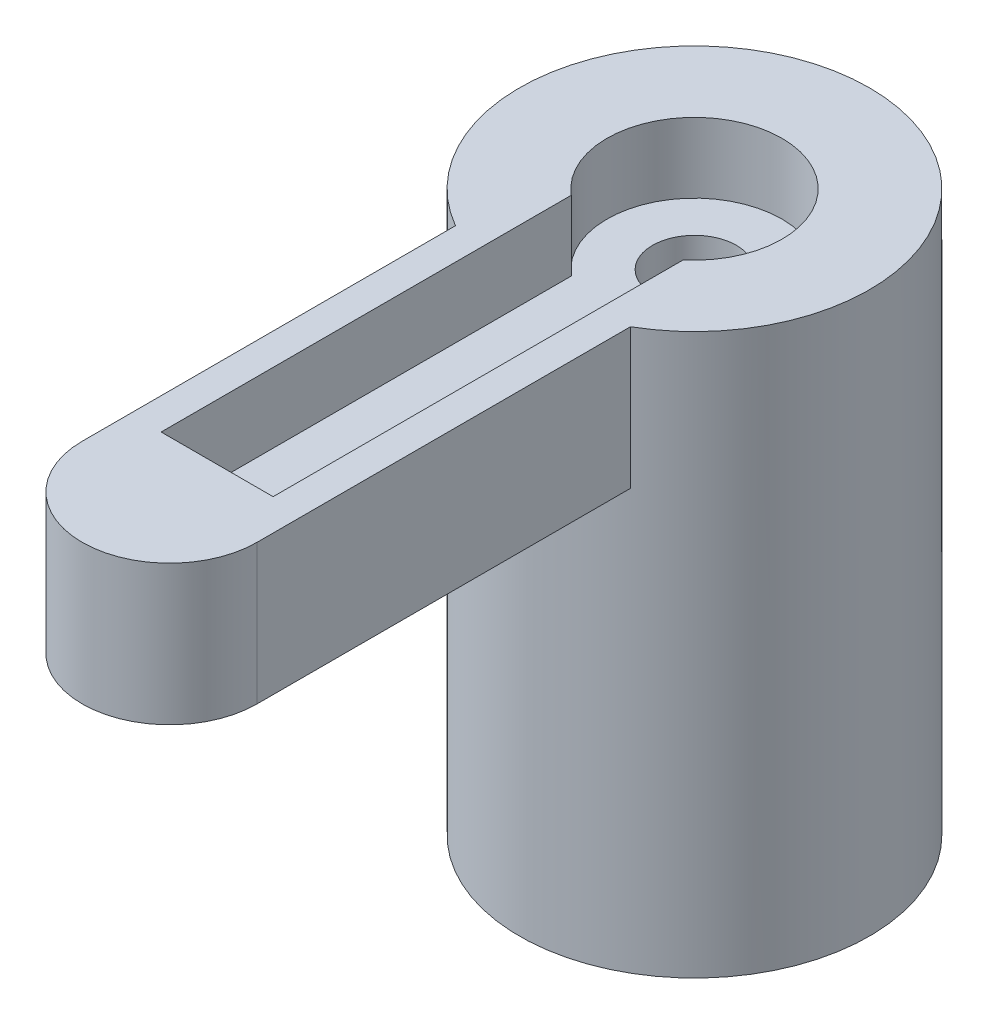
ISO-10303-21;
HEADER;
FILE_DESCRIPTION(('STEP AP214'),'2;1');
FILE_NAME('part.step','',(''),(''),'','','');
FILE_SCHEMA(('AUTOMOTIVE_DESIGN { 1 0 10303 214 1 1 1 1 }'));
ENDSEC;
DATA;
#1=APPLICATION_CONTEXT('core data for automotive mechanical design processes');
#2=APPLICATION_PROTOCOL_DEFINITION('international standard','automotive_design',2000,#1);
#3=PRODUCT_CONTEXT('',#1,'mechanical');
#4=PRODUCT('Part','Part','',(#3));
#5=PRODUCT_RELATED_PRODUCT_CATEGORY('part','',(#4));
#6=PRODUCT_DEFINITION_FORMATION('','',#4);
#7=PRODUCT_DEFINITION_CONTEXT('part definition',#1,'design');
#8=PRODUCT_DEFINITION('design','',#6,#7);
#9=PRODUCT_DEFINITION_SHAPE('','',#8);
#10=(LENGTH_UNIT() NAMED_UNIT(*) SI_UNIT(.MILLI.,.METRE.));
#11=(NAMED_UNIT(*) PLANE_ANGLE_UNIT() SI_UNIT($,.RADIAN.));
#12=(NAMED_UNIT(*) SI_UNIT($,.STERADIAN.) SOLID_ANGLE_UNIT());
#13=UNCERTAINTY_MEASURE_WITH_UNIT(LENGTH_MEASURE(1.E-05),#10,'distance_accuracy_value','');
#14=(GEOMETRIC_REPRESENTATION_CONTEXT(3) GLOBAL_UNCERTAINTY_ASSIGNED_CONTEXT((#13)) GLOBAL_UNIT_ASSIGNED_CONTEXT((#10,
#11,#12)) REPRESENTATION_CONTEXT('',''));
#15=CARTESIAN_POINT('',(0.,0.,0.));
#16=DIRECTION('',(0.,0.,1.));
#17=DIRECTION('',(1.,0.,0.));
#18=AXIS2_PLACEMENT_3D('',#15,#16,#17);
#19=CARTESIAN_POINT('',(0.,0.,0.));
#20=DIRECTION('',(0.,1.,0.));
#21=DIRECTION('',(0.,0.,1.));
#22=AXIS2_PLACEMENT_3D('',#19,#20,#21);
#23=PLANE('',#22);
#24=CARTESIAN_POINT('',(0.,0.,0.));
#25=DIRECTION('',(0.,-1.,0.));
#26=DIRECTION('',(0.,0.,-1.));
#27=AXIS2_PLACEMENT_3D('',#24,#25,#26);
#28=CIRCLE('',#27,6.35);
#29=CARTESIAN_POINT('',(3.175,0.,5.49926131403118));
#30=VERTEX_POINT('',#29);
#31=CARTESIAN_POINT('',(-3.175,0.,5.49926131403119));
#32=VERTEX_POINT('',#31);
#33=EDGE_CURVE('E126',#30,#32,#28,.T.);
#34=ORIENTED_EDGE('',*,*,#33,.F.);
#35=DIRECTION('',(0.,0.,1.));
#36=VECTOR('',#35,1.);
#37=CARTESIAN_POINT('',(3.175,0.,0.));
#38=LINE('',#37,#36);
#39=CARTESIAN_POINT('',(3.175,0.,19.05));
#40=VERTEX_POINT('',#39);
#41=EDGE_CURVE('E128',#30,#40,#38,.T.);
#42=ORIENTED_EDGE('',*,*,#41,.T.);
#43=CARTESIAN_POINT('',(0.,0.,19.05));
#44=DIRECTION('',(0.,1.,0.));
#45=DIRECTION('',(0.,0.,1.));
#46=AXIS2_PLACEMENT_3D('',#43,#44,#45);
#47=CIRCLE('',#46,3.175);
#48=CARTESIAN_POINT('',(-3.17499999999999,0.,19.05));
#49=VERTEX_POINT('',#48);
#50=EDGE_CURVE('E142',#49,#40,#47,.T.);
#51=ORIENTED_EDGE('',*,*,#50,.F.);
#52=DIRECTION('',(0.,0.,1.));
#53=VECTOR('',#52,1.);
#54=CARTESIAN_POINT('',(-3.175,0.,0.));
#55=LINE('',#54,#53);
#56=EDGE_CURVE('E129',#32,#49,#55,.T.);
#57=ORIENTED_EDGE('',*,*,#56,.F.);
#58=EDGE_LOOP('',(#34,#42,#51,#57));
#59=FACE_BOUND('',#58,.T.);
#60=ADVANCED_FACE('F50',(#59),#23,.F.);
#61=CARTESIAN_POINT('',(0.,5.08,0.));
#62=DIRECTION('',(0.,-1.,0.));
#63=DIRECTION('',(0.,0.,-1.));
#64=AXIS2_PLACEMENT_3D('',#61,#62,#63);
#65=CYLINDRICAL_SURFACE('',#64,6.35);
#66=DIRECTION('',(0.,-1.,0.));
#67=VECTOR('',#66,1.);
#68=CARTESIAN_POINT('',(3.175,5.08,5.49926131403118));
#69=LINE('',#68,#67);
#70=CARTESIAN_POINT('',(3.175,5.08,5.49926131403118));
#71=VERTEX_POINT('',#70);
#72=EDGE_CURVE('E76',#71,#30,#69,.T.);
#73=ORIENTED_EDGE('',*,*,#72,.T.);
#74=ORIENTED_EDGE('',*,*,#33,.T.);
#75=DIRECTION('',(0.,-1.,0.));
#76=VECTOR('',#75,1.);
#77=CARTESIAN_POINT('',(-3.175,5.08,5.49926131403119));
#78=LINE('',#77,#76);
#79=CARTESIAN_POINT('',(-3.175,5.08,5.49926131403119));
#80=VERTEX_POINT('',#79);
#81=EDGE_CURVE('E12',#80,#32,#78,.T.);
#82=ORIENTED_EDGE('',*,*,#81,.F.);
#83=CARTESIAN_POINT('',(0.,5.08,0.));
#84=DIRECTION('',(0.,1.,0.));
#85=DIRECTION('',(0.,0.,1.));
#86=AXIS2_PLACEMENT_3D('',#83,#84,#85);
#87=CIRCLE('',#86,6.35);
#88=EDGE_CURVE('E137',#71,#80,#87,.T.);
#89=ORIENTED_EDGE('',*,*,#88,.F.);
#90=EDGE_LOOP('',(#73,#74,#82,#89));
#91=FACE_BOUND('',#90,.T.);
#92=CARTESIAN_POINT('',(0.,-15.24,0.));
#93=DIRECTION('',(0.,-1.,0.));
#94=DIRECTION('',(0.,0.,-1.));
#95=AXIS2_PLACEMENT_3D('',#92,#93,#94);
#96=CIRCLE('',#95,6.35);
#97=CARTESIAN_POINT('',(0.,-15.24,-6.35));
#98=VERTEX_POINT('',#97);
#99=EDGE_CURVE('E132',#98,#98,#96,.T.);
#100=ORIENTED_EDGE('',*,*,#99,.F.);
#101=EDGE_LOOP('',(#100));
#102=FACE_BOUND('',#101,.T.);
#103=ADVANCED_FACE('F135',(#91,#102),#65,.T.);
#104=CARTESIAN_POINT('',(-3.175,5.08,0.));
#105=DIRECTION('',(1.,0.,0.));
#106=DIRECTION('',(0.,0.,-1.));
#107=AXIS2_PLACEMENT_3D('',#104,#105,#106);
#108=PLANE('',#107);
#109=ORIENTED_EDGE('',*,*,#56,.T.);
#110=DIRECTION('',(0.,-1.,0.));
#111=VECTOR('',#110,1.);
#112=CARTESIAN_POINT('',(-3.17499999999999,5.08,19.05));
#113=LINE('',#112,#111);
#114=CARTESIAN_POINT('',(-3.17499999999999,5.08,19.05));
#115=VERTEX_POINT('',#114);
#116=EDGE_CURVE('E59',#115,#49,#113,.T.);
#117=ORIENTED_EDGE('',*,*,#116,.F.);
#118=DIRECTION('',(0.,0.,1.));
#119=VECTOR('',#118,1.);
#120=CARTESIAN_POINT('',(-3.175,5.08,0.));
#121=LINE('',#120,#119);
#122=EDGE_CURVE('E100',#80,#115,#121,.T.);
#123=ORIENTED_EDGE('',*,*,#122,.F.);
#124=ORIENTED_EDGE('',*,*,#81,.T.);
#125=EDGE_LOOP('',(#109,#117,#123,#124));
#126=FACE_BOUND('',#125,.T.);
#127=ADVANCED_FACE('F196',(#126),#108,.F.);
#128=CARTESIAN_POINT('',(0.,5.08,19.05));
#129=DIRECTION('',(0.,-1.,0.));
#130=DIRECTION('',(0.,0.,-1.));
#131=AXIS2_PLACEMENT_3D('',#128,#129,#130);
#132=CYLINDRICAL_SURFACE('',#131,3.175);
#133=ORIENTED_EDGE('',*,*,#50,.T.);
#134=DIRECTION('',(0.,-1.,0.));
#135=VECTOR('',#134,1.);
#136=CARTESIAN_POINT('',(3.175,5.08,19.05));
#137=LINE('',#136,#135);
#138=CARTESIAN_POINT('',(3.175,5.08,19.05));
#139=VERTEX_POINT('',#138);
#140=EDGE_CURVE('E93',#139,#40,#137,.T.);
#141=ORIENTED_EDGE('',*,*,#140,.F.);
#142=CARTESIAN_POINT('',(0.,5.08,19.05));
#143=DIRECTION('',(0.,1.,0.));
#144=DIRECTION('',(0.,0.,1.));
#145=AXIS2_PLACEMENT_3D('',#142,#143,#144);
#146=CIRCLE('',#145,3.175);
#147=EDGE_CURVE('E189',#115,#139,#146,.T.);
#148=ORIENTED_EDGE('',*,*,#147,.F.);
#149=ORIENTED_EDGE('',*,*,#116,.T.);
#150=EDGE_LOOP('',(#133,#141,#148,#149));
#151=FACE_BOUND('',#150,.T.);
#152=ADVANCED_FACE('F195',(#151),#132,.T.);
#153=CARTESIAN_POINT('',(0.,5.08,0.));
#154=DIRECTION('',(0.,-1.,0.));
#155=DIRECTION('',(0.,0.,-1.));
#156=AXIS2_PLACEMENT_3D('',#153,#154,#155);
#157=CYLINDRICAL_SURFACE('',#156,1.524);
#158=CARTESIAN_POINT('',(0.,2.54,0.));
#159=DIRECTION('',(0.,-1.,0.));
#160=DIRECTION('',(0.,0.,-1.));
#161=AXIS2_PLACEMENT_3D('',#158,#159,#160);
#162=CIRCLE('',#161,1.524);
#163=CARTESIAN_POINT('',(0.,2.54,-1.524));
#164=VERTEX_POINT('',#163);
#165=EDGE_CURVE('E153',#164,#164,#162,.T.);
#166=ORIENTED_EDGE('',*,*,#165,.F.);
#167=EDGE_LOOP('',(#166));
#168=FACE_BOUND('',#167,.T.);
#169=CARTESIAN_POINT('',(0.,0.,0.));
#170=DIRECTION('',(0.,-1.,0.));
#171=DIRECTION('',(0.,0.,-1.));
#172=AXIS2_PLACEMENT_3D('',#169,#170,#171);
#173=CIRCLE('',#172,1.524);
#174=CARTESIAN_POINT('',(0.,0.,-1.524));
#175=VERTEX_POINT('',#174);
#176=EDGE_CURVE('E133',#175,#175,#173,.T.);
#177=ORIENTED_EDGE('',*,*,#176,.T.);
#178=EDGE_LOOP('',(#177));
#179=FACE_BOUND('',#178,.T.);
#180=ADVANCED_FACE('F52',(#168,#179),#157,.F.);
#181=CARTESIAN_POINT('',(3.175,5.08,0.));
#182=DIRECTION('',(1.,0.,0.));
#183=DIRECTION('',(0.,0.,-1.));
#184=AXIS2_PLACEMENT_3D('',#181,#182,#183);
#185=PLANE('',#184);
#186=ORIENTED_EDGE('',*,*,#41,.F.);
#187=ORIENTED_EDGE('',*,*,#72,.F.);
#188=DIRECTION('',(0.,0.,1.));
#189=VECTOR('',#188,1.);
#190=CARTESIAN_POINT('',(3.175,5.08,0.));
#191=LINE('',#190,#189);
#192=EDGE_CURVE('E139',#71,#139,#191,.T.);
#193=ORIENTED_EDGE('',*,*,#192,.T.);
#194=ORIENTED_EDGE('',*,*,#140,.T.);
#195=EDGE_LOOP('',(#186,#187,#193,#194));
#196=FACE_BOUND('',#195,.T.);
#197=ADVANCED_FACE('F141',(#196),#185,.T.);
#198=CARTESIAN_POINT('',(0.,5.08,0.));
#199=DIRECTION('',(0.,1.,0.));
#200=DIRECTION('',(0.,0.,1.));
#201=AXIS2_PLACEMENT_3D('',#198,#199,#200);
#202=PLANE('',#201);
#203=DIRECTION('',(1.,0.,0.));
#204=VECTOR('',#203,1.);
#205=CARTESIAN_POINT('',(-2.032,5.08,17.3245473419409));
#206=LINE('',#205,#204);
#207=CARTESIAN_POINT('',(-2.032,5.08,17.3245473419409));
#208=VERTEX_POINT('',#207);
#209=CARTESIAN_POINT('',(2.032,5.08,17.3245473419409));
#210=VERTEX_POINT('',#209);
#211=EDGE_CURVE('E170',#208,#210,#206,.T.);
#212=ORIENTED_EDGE('',*,*,#211,.F.);
#213=DIRECTION('',(0.,0.,1.));
#214=VECTOR('',#213,1.);
#215=CARTESIAN_POINT('',(-2.032,5.08,-0.455452658059131));
#216=LINE('',#215,#214);
#217=CARTESIAN_POINT('',(-2.032,5.08,2.43959033446192));
#218=VERTEX_POINT('',#217);
#219=EDGE_CURVE('E163',#218,#208,#216,.T.);
#220=ORIENTED_EDGE('',*,*,#219,.F.);
#221=CARTESIAN_POINT('',(0.,5.08,0.));
#222=DIRECTION('',(0.,1.,0.));
#223=DIRECTION('',(0.,0.,1.));
#224=AXIS2_PLACEMENT_3D('',#221,#222,#223);
#225=CIRCLE('',#224,3.175);
#226=CARTESIAN_POINT('',(2.032,5.08,2.43959033446191));
#227=VERTEX_POINT('',#226);
#228=EDGE_CURVE('E182',#227,#218,#225,.T.);
#229=ORIENTED_EDGE('',*,*,#228,.F.);
#230=DIRECTION('',(0.,0.,1.));
#231=VECTOR('',#230,1.);
#232=CARTESIAN_POINT('',(2.032,5.08,-0.455452658059131));
#233=LINE('',#232,#231);
#234=EDGE_CURVE('E67',#227,#210,#233,.T.);
#235=ORIENTED_EDGE('',*,*,#234,.T.);
#236=EDGE_LOOP('',(#212,#220,#229,#235));
#237=FACE_BOUND('',#236,.T.);
#238=ORIENTED_EDGE('',*,*,#88,.T.);
#239=ORIENTED_EDGE('',*,*,#122,.T.);
#240=ORIENTED_EDGE('',*,*,#147,.T.);
#241=ORIENTED_EDGE('',*,*,#192,.F.);
#242=EDGE_LOOP('',(#238,#239,#240,#241));
#243=FACE_BOUND('',#242,.T.);
#244=ADVANCED_FACE('F210',(#237,#243),#202,.T.);
#245=CARTESIAN_POINT('',(-2.032,2.54,17.3245473419409));
#246=DIRECTION('',(0.,0.,1.));
#247=DIRECTION('',(1.,0.,0.));
#248=AXIS2_PLACEMENT_3D('',#245,#246,#247);
#249=PLANE('',#248);
#250=ORIENTED_EDGE('',*,*,#211,.T.);
#251=DIRECTION('',(0.,1.,0.));
#252=VECTOR('',#251,1.);
#253=CARTESIAN_POINT('',(2.032,2.54,17.3245473419409));
#254=LINE('',#253,#252);
#255=CARTESIAN_POINT('',(2.032,2.54,17.3245473419409));
#256=VERTEX_POINT('',#255);
#257=EDGE_CURVE('E177',#256,#210,#254,.T.);
#258=ORIENTED_EDGE('',*,*,#257,.F.);
#259=DIRECTION('',(1.,0.,0.));
#260=VECTOR('',#259,1.);
#261=CARTESIAN_POINT('',(-2.032,2.54,17.3245473419409));
#262=LINE('',#261,#260);
#263=CARTESIAN_POINT('',(-2.032,2.54,17.3245473419409));
#264=VERTEX_POINT('',#263);
#265=EDGE_CURVE('E162',#264,#256,#262,.T.);
#266=ORIENTED_EDGE('',*,*,#265,.F.);
#267=DIRECTION('',(0.,1.,0.));
#268=VECTOR('',#267,1.);
#269=CARTESIAN_POINT('',(-2.032,2.54,17.3245473419409));
#270=LINE('',#269,#268);
#271=EDGE_CURVE('E168',#264,#208,#270,.T.);
#272=ORIENTED_EDGE('',*,*,#271,.T.);
#273=EDGE_LOOP('',(#250,#258,#266,#272));
#274=FACE_BOUND('',#273,.T.);
#275=ADVANCED_FACE('F217',(#274),#249,.F.);
#276=CARTESIAN_POINT('',(-2.032,2.54,-0.455452658059131));
#277=DIRECTION('',(-1.,0.,0.));
#278=DIRECTION('',(0.,0.,1.));
#279=AXIS2_PLACEMENT_3D('',#276,#277,#278);
#280=PLANE('',#279);
#281=DIRECTION('',(0.,1.,0.));
#282=VECTOR('',#281,1.);
#283=CARTESIAN_POINT('',(-2.032,2.54,2.43959033446192));
#284=LINE('',#283,#282);
#285=CARTESIAN_POINT('',(-2.032,2.54,2.43959033446192));
#286=VERTEX_POINT('',#285);
#287=EDGE_CURVE('E179',#286,#218,#284,.T.);
#288=ORIENTED_EDGE('',*,*,#287,.T.);
#289=ORIENTED_EDGE('',*,*,#219,.T.);
#290=ORIENTED_EDGE('',*,*,#271,.F.);
#291=DIRECTION('',(0.,0.,1.));
#292=VECTOR('',#291,1.);
#293=CARTESIAN_POINT('',(-2.032,2.54,-0.455452658059131));
#294=LINE('',#293,#292);
#295=EDGE_CURVE('E166',#286,#264,#294,.T.);
#296=ORIENTED_EDGE('',*,*,#295,.F.);
#297=EDGE_LOOP('',(#288,#289,#290,#296));
#298=FACE_BOUND('',#297,.T.);
#299=ADVANCED_FACE('F260',(#298),#280,.F.);
#300=CARTESIAN_POINT('',(2.032,2.54,-0.455452658059131));
#301=DIRECTION('',(-1.,0.,0.));
#302=DIRECTION('',(0.,0.,1.));
#303=AXIS2_PLACEMENT_3D('',#300,#301,#302);
#304=PLANE('',#303);
#305=DIRECTION('',(0.,0.,1.));
#306=VECTOR('',#305,1.);
#307=CARTESIAN_POINT('',(2.032,2.54,-0.455452658059131));
#308=LINE('',#307,#306);
#309=CARTESIAN_POINT('',(2.032,2.54,2.43959033446191));
#310=VERTEX_POINT('',#309);
#311=EDGE_CURVE('E160',#310,#256,#308,.T.);
#312=ORIENTED_EDGE('',*,*,#311,.T.);
#313=ORIENTED_EDGE('',*,*,#257,.T.);
#314=ORIENTED_EDGE('',*,*,#234,.F.);
#315=DIRECTION('',(0.,1.,0.));
#316=VECTOR('',#315,1.);
#317=CARTESIAN_POINT('',(2.032,2.54,2.43959033446191));
#318=LINE('',#317,#316);
#319=EDGE_CURVE('E186',#310,#227,#318,.T.);
#320=ORIENTED_EDGE('',*,*,#319,.F.);
#321=EDGE_LOOP('',(#312,#313,#314,#320));
#322=FACE_BOUND('',#321,.T.);
#323=ADVANCED_FACE('F258',(#322),#304,.T.);
#324=CARTESIAN_POINT('',(0.,2.54,0.));
#325=DIRECTION('',(0.,-1.,0.));
#326=DIRECTION('',(0.,0.,-1.));
#327=AXIS2_PLACEMENT_3D('',#324,#325,#326);
#328=PLANE('',#327);
#329=ORIENTED_EDGE('',*,*,#165,.T.);
#330=EDGE_LOOP('',(#329));
#331=FACE_BOUND('',#330,.T.);
#332=CARTESIAN_POINT('',(0.,2.54,0.));
#333=DIRECTION('',(0.,1.,0.));
#334=DIRECTION('',(0.,0.,1.));
#335=AXIS2_PLACEMENT_3D('',#332,#333,#334);
#336=CIRCLE('',#335,3.175);
#337=EDGE_CURVE('E171',#310,#286,#336,.T.);
#338=ORIENTED_EDGE('',*,*,#337,.T.);
#339=ORIENTED_EDGE('',*,*,#295,.T.);
#340=ORIENTED_EDGE('',*,*,#265,.T.);
#341=ORIENTED_EDGE('',*,*,#311,.F.);
#342=EDGE_LOOP('',(#338,#339,#340,#341));
#343=FACE_BOUND('',#342,.T.);
#344=ADVANCED_FACE('F252',(#331,#343),#328,.F.);
#345=CARTESIAN_POINT('',(0.,2.54,0.));
#346=DIRECTION('',(0.,1.,0.));
#347=DIRECTION('',(0.,0.,1.));
#348=AXIS2_PLACEMENT_3D('',#345,#346,#347);
#349=CYLINDRICAL_SURFACE('',#348,3.175);
#350=ORIENTED_EDGE('',*,*,#319,.T.);
#351=ORIENTED_EDGE('',*,*,#228,.T.);
#352=ORIENTED_EDGE('',*,*,#287,.F.);
#353=ORIENTED_EDGE('',*,*,#337,.F.);
#354=EDGE_LOOP('',(#350,#351,#352,#353));
#355=FACE_BOUND('',#354,.T.);
#356=ADVANCED_FACE('F241',(#355),#349,.F.);
#357=CARTESIAN_POINT('',(0.,-15.24,0.));
#358=DIRECTION('',(0.,-1.,0.));
#359=DIRECTION('',(0.,0.,-1.));
#360=AXIS2_PLACEMENT_3D('',#357,#358,#359);
#361=PLANE('',#360);
#362=CARTESIAN_POINT('',(0.,-15.24,0.));
#363=DIRECTION('',(0.,-1.,0.));
#364=DIRECTION('',(0.,0.,-1.));
#365=AXIS2_PLACEMENT_3D('',#362,#363,#364);
#366=CIRCLE('',#365,3.429);
#367=CARTESIAN_POINT('',(0.,-15.24,-3.429));
#368=VERTEX_POINT('',#367);
#369=EDGE_CURVE('E230',#368,#368,#366,.T.);
#370=ORIENTED_EDGE('',*,*,#369,.F.);
#371=EDGE_LOOP('',(#370));
#372=FACE_BOUND('',#371,.T.);
#373=ORIENTED_EDGE('',*,*,#99,.T.);
#374=EDGE_LOOP('',(#373));
#375=FACE_BOUND('',#374,.T.);
#376=ADVANCED_FACE('F238',(#372,#375),#361,.T.);
#377=CARTESIAN_POINT('',(0.,0.,0.));
#378=DIRECTION('',(0.,-1.,0.));
#379=DIRECTION('',(0.,0.,-1.));
#380=AXIS2_PLACEMENT_3D('',#377,#378,#379);
#381=CYLINDRICAL_SURFACE('',#380,3.429);
#382=CARTESIAN_POINT('',(0.,0.,0.));
#383=DIRECTION('',(0.,-1.,0.));
#384=DIRECTION('',(0.,0.,-1.));
#385=AXIS2_PLACEMENT_3D('',#382,#383,#384);
#386=CIRCLE('',#385,3.429);
#387=CARTESIAN_POINT('',(0.,0.,-3.429));
#388=VERTEX_POINT('',#387);
#389=EDGE_CURVE('E228',#388,#388,#386,.T.);
#390=CARTESIAN_POINT('',(0.,0.,-3.429));
#391=CARTESIAN_POINT('',(0.,-0.15875,-3.429));
#392=CARTESIAN_POINT('',(0.,-0.3175,-3.429));
#393=CARTESIAN_POINT('',(0.,-0.635,-3.429));
#394=CARTESIAN_POINT('',(0.,-0.79375,-3.429));
#395=CARTESIAN_POINT('',(0.,-1.11125,-3.429));
#396=CARTESIAN_POINT('',(0.,-1.27,-3.429));
#397=CARTESIAN_POINT('',(0.,-1.5875,-3.429));
#398=CARTESIAN_POINT('',(0.,-1.74625,-3.429));
#399=CARTESIAN_POINT('',(0.,-2.06375,-3.429));
#400=CARTESIAN_POINT('',(0.,-2.2225,-3.429));
#401=CARTESIAN_POINT('',(0.,-2.54,-3.429));
#402=CARTESIAN_POINT('',(0.,-2.69875,-3.429));
#403=CARTESIAN_POINT('',(0.,-3.01625,-3.429));
#404=CARTESIAN_POINT('',(0.,-3.175,-3.429));
#405=CARTESIAN_POINT('',(0.,-3.4925,-3.429));
#406=CARTESIAN_POINT('',(0.,-3.65125,-3.429));
#407=CARTESIAN_POINT('',(0.,-3.96875,-3.429));
#408=CARTESIAN_POINT('',(0.,-4.1275,-3.429));
#409=CARTESIAN_POINT('',(0.,-4.445,-3.429));
#410=CARTESIAN_POINT('',(0.,-4.60375,-3.429));
#411=CARTESIAN_POINT('',(0.,-4.92125,-3.429));
#412=CARTESIAN_POINT('',(0.,-5.08,-3.429));
#413=CARTESIAN_POINT('',(0.,-5.3975,-3.429));
#414=CARTESIAN_POINT('',(0.,-5.55625,-3.429));
#415=CARTESIAN_POINT('',(0.,-5.87375,-3.429));
#416=CARTESIAN_POINT('',(0.,-6.0325,-3.429));
#417=CARTESIAN_POINT('',(0.,-6.35,-3.429));
#418=CARTESIAN_POINT('',(0.,-6.50875,-3.429));
#419=CARTESIAN_POINT('',(0.,-6.82625,-3.429));
#420=CARTESIAN_POINT('',(0.,-6.985,-3.429));
#421=CARTESIAN_POINT('',(0.,-7.3025,-3.429));
#422=CARTESIAN_POINT('',(0.,-7.46125,-3.429));
#423=CARTESIAN_POINT('',(0.,-7.77875,-3.429));
#424=CARTESIAN_POINT('',(0.,-7.9375,-3.429));
#425=CARTESIAN_POINT('',(0.,-8.255,-3.429));
#426=CARTESIAN_POINT('',(0.,-8.41375,-3.429));
#427=CARTESIAN_POINT('',(0.,-8.73125,-3.429));
#428=CARTESIAN_POINT('',(0.,-8.89,-3.429));
#429=CARTESIAN_POINT('',(0.,-9.2075,-3.429));
#430=CARTESIAN_POINT('',(0.,-9.36625,-3.429));
#431=CARTESIAN_POINT('',(0.,-9.68375,-3.429));
#432=CARTESIAN_POINT('',(0.,-9.8425,-3.429));
#433=CARTESIAN_POINT('',(0.,-10.16,-3.429));
#434=CARTESIAN_POINT('',(0.,-10.31875,-3.429));
#435=CARTESIAN_POINT('',(0.,-10.63625,-3.429));
#436=CARTESIAN_POINT('',(0.,-10.795,-3.429));
#437=CARTESIAN_POINT('',(0.,-11.1125,-3.429));
#438=CARTESIAN_POINT('',(0.,-11.27125,-3.429));
#439=CARTESIAN_POINT('',(0.,-11.58875,-3.429));
#440=CARTESIAN_POINT('',(0.,-11.7475,-3.429));
#441=CARTESIAN_POINT('',(0.,-12.065,-3.429));
#442=CARTESIAN_POINT('',(0.,-12.22375,-3.429));
#443=CARTESIAN_POINT('',(0.,-12.54125,-3.429));
#444=CARTESIAN_POINT('',(0.,-12.7,-3.429));
#445=CARTESIAN_POINT('',(0.,-13.0175,-3.429));
#446=CARTESIAN_POINT('',(0.,-13.17625,-3.429));
#447=CARTESIAN_POINT('',(0.,-13.49375,-3.429));
#448=CARTESIAN_POINT('',(0.,-13.6525,-3.429));
#449=CARTESIAN_POINT('',(0.,-13.97,-3.429));
#450=CARTESIAN_POINT('',(0.,-14.12875,-3.429));
#451=CARTESIAN_POINT('',(0.,-14.44625,-3.429));
#452=CARTESIAN_POINT('',(0.,-14.605,-3.429));
#453=CARTESIAN_POINT('',(0.,-14.9225,-3.429));
#454=CARTESIAN_POINT('',(0.,-15.08125,-3.429));
#455=CARTESIAN_POINT('',(0.,-15.24,-3.429));
#456=B_SPLINE_CURVE_WITH_KNOTS('',3,(#390,#391,#392,#393,#394,#395,#396,#397,#398,#399,#400,
#401,#402,#403,#404,#405,#406,#407,#408,#409,#410,#411,#412,#413,#414,#415,#416,#417,#418,#419,
#420,#421,#422,#423,#424,#425,#426,#427,#428,#429,#430,#431,#432,#433,#434,#435,#436,#437,#438,
#439,#440,#441,#442,#443,#444,#445,#446,#447,#448,#449,#450,#451,#452,#453,#454,#455),
.UNSPECIFIED.,.F.,.F.,(4,2,2,2,2,2,2,2,2,2,2,2,2,2,2,2,2,2,2,2,2,2,2,2,2,2,2,2,2,2,2,2,4),(0.,
0.47625,0.9525,1.42875,1.905,2.38125,2.8575,3.33375,3.81,4.28625,4.7625,5.23875,5.715,6.19125,
6.6675,7.14375,7.62,8.09625,8.5725,9.04875,9.525,10.00125,10.4775,10.95375,11.43,11.90625,
12.3825,12.85875,13.335,13.81125,14.2875,14.76375,15.24),.UNSPECIFIED.);
#457=EDGE_CURVE('BSEAM236',#388,#368,#456,.T.);
#458=ORIENTED_EDGE('',*,*,#389,.F.);
#459=ORIENTED_EDGE('',*,*,#369,.T.);
#460=ORIENTED_EDGE('',*,*,#457,.T.);
#461=ORIENTED_EDGE('',*,*,#457,.F.);
#462=EDGE_LOOP('',(#458,#460,#459,#461));
#463=FACE_BOUND('',#462,.T.);
#464=ADVANCED_FACE('F236',(#463),#381,.F.);
#465=CARTESIAN_POINT('',(0.,0.,0.));
#466=DIRECTION('',(0.,-1.,0.));
#467=DIRECTION('',(0.,0.,-1.));
#468=AXIS2_PLACEMENT_3D('',#465,#466,#467);
#469=PLANE('',#468);
#470=ORIENTED_EDGE('',*,*,#176,.F.);
#471=EDGE_LOOP('',(#470));
#472=FACE_BOUND('',#471,.T.);
#473=ORIENTED_EDGE('',*,*,#389,.T.);
#474=EDGE_LOOP('',(#473));
#475=FACE_BOUND('',#474,.T.);
#476=ADVANCED_FACE('F249',(#472,#475),#469,.T.);
#477=CLOSED_SHELL('',(#60,#103,#127,#152,#180,#197,#244,#275,#299,#323,#344,#356,#376,#464,#476));
#478=MANIFOLD_SOLID_BREP('B2',#477);
#479=ADVANCED_BREP_SHAPE_REPRESENTATION('',(#18,#478),#14);
#480=SHAPE_DEFINITION_REPRESENTATION(#9,#479);
ENDSEC;
END-ISO-10303-21;
